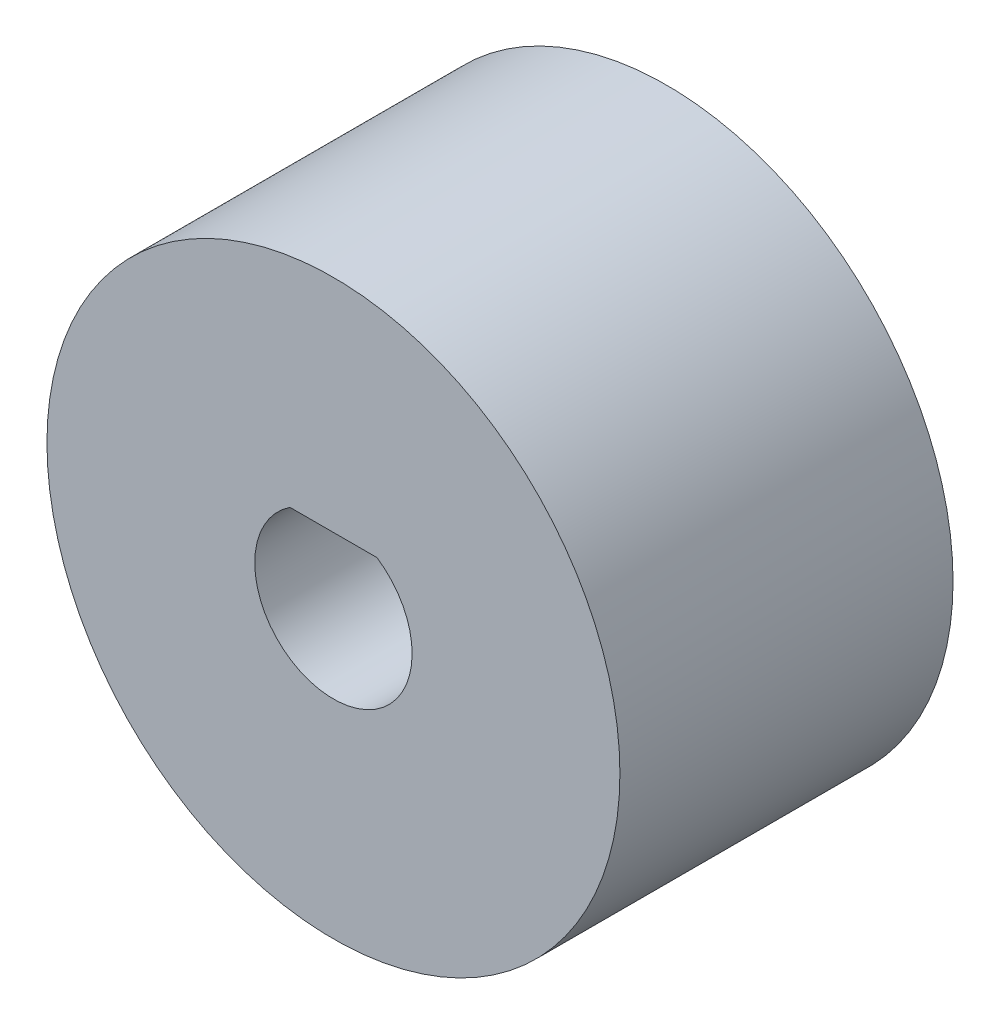
ISO-10303-21;
HEADER;
FILE_DESCRIPTION(('STEP AP214'),'2;1');
FILE_NAME('part.step','',(''),(''),'','','');
FILE_SCHEMA(('AUTOMOTIVE_DESIGN { 1 0 10303 214 1 1 1 1 }'));
ENDSEC;
DATA;
#1=APPLICATION_CONTEXT('core data for automotive mechanical design processes');
#2=APPLICATION_PROTOCOL_DEFINITION('international standard','automotive_design',2000,#1);
#3=PRODUCT_CONTEXT('',#1,'mechanical');
#4=PRODUCT('Part','Part','',(#3));
#5=PRODUCT_RELATED_PRODUCT_CATEGORY('part','',(#4));
#6=PRODUCT_DEFINITION_FORMATION('','',#4);
#7=PRODUCT_DEFINITION_CONTEXT('part definition',#1,'design');
#8=PRODUCT_DEFINITION('design','',#6,#7);
#9=PRODUCT_DEFINITION_SHAPE('','',#8);
#10=(LENGTH_UNIT() NAMED_UNIT(*) SI_UNIT(.MILLI.,.METRE.));
#11=(NAMED_UNIT(*) PLANE_ANGLE_UNIT() SI_UNIT($,.RADIAN.));
#12=(NAMED_UNIT(*) SI_UNIT($,.STERADIAN.) SOLID_ANGLE_UNIT());
#13=UNCERTAINTY_MEASURE_WITH_UNIT(LENGTH_MEASURE(1.E-05),#10,'distance_accuracy_value','');
#14=(GEOMETRIC_REPRESENTATION_CONTEXT(3) GLOBAL_UNCERTAINTY_ASSIGNED_CONTEXT((#13)) GLOBAL_UNIT_ASSIGNED_CONTEXT((#10,
#11,#12)) REPRESENTATION_CONTEXT('',''));
#15=CARTESIAN_POINT('',(0.,0.,0.));
#16=DIRECTION('',(0.,0.,1.));
#17=DIRECTION('',(1.,0.,0.));
#18=AXIS2_PLACEMENT_3D('',#15,#16,#17);
#19=CARTESIAN_POINT('',(0.,0.,12.7));
#20=DIRECTION('',(0.,0.,1.));
#21=DIRECTION('',(1.,0.,0.));
#22=AXIS2_PLACEMENT_3D('',#19,#20,#21);
#23=PLANE('',#22);
#24=CARTESIAN_POINT('',(0.,0.,12.7));
#25=DIRECTION('',(0.,0.,1.));
#26=DIRECTION('',(1.,0.,0.));
#27=AXIS2_PLACEMENT_3D('',#24,#25,#26);
#28=CIRCLE('',#27,10.922);
#29=CARTESIAN_POINT('',(10.922,0.,12.7));
#30=VERTEX_POINT('',#29);
#31=EDGE_CURVE('E11',#30,#30,#28,.T.);
#32=ORIENTED_EDGE('',*,*,#31,.T.);
#33=EDGE_LOOP('',(#32));
#34=FACE_BOUND('',#33,.T.);
#35=DIRECTION('',(-1.,0.,0.));
#36=VECTOR('',#35,1.);
#37=CARTESIAN_POINT('',(-1.6583123951777,2.5,12.7));
#38=LINE('',#37,#36);
#39=CARTESIAN_POINT('',(1.6583123951777,2.5,12.7));
#40=VERTEX_POINT('',#39);
#41=CARTESIAN_POINT('',(-1.6583123951777,2.5,12.7));
#42=VERTEX_POINT('',#41);
#43=EDGE_CURVE('E74',#40,#42,#38,.T.);
#44=ORIENTED_EDGE('',*,*,#43,.F.);
#45=CARTESIAN_POINT('',(0.,0.,12.7));
#46=DIRECTION('',(0.,0.,1.));
#47=DIRECTION('',(1.,0.,0.));
#48=AXIS2_PLACEMENT_3D('',#45,#46,#47);
#49=CIRCLE('',#48,3.);
#50=EDGE_CURVE('E65',#42,#40,#49,.T.);
#51=ORIENTED_EDGE('',*,*,#50,.F.);
#52=EDGE_LOOP('',(#44,#51));
#53=FACE_BOUND('',#52,.T.);
#54=ADVANCED_FACE('F33',(#34,#53),#23,.T.);
#55=CARTESIAN_POINT('',(0.,0.,0.));
#56=DIRECTION('',(0.,0.,1.));
#57=DIRECTION('',(1.,0.,0.));
#58=AXIS2_PLACEMENT_3D('',#55,#56,#57);
#59=PLANE('',#58);
#60=CARTESIAN_POINT('',(0.,0.,0.));
#61=DIRECTION('',(0.,0.,1.));
#62=DIRECTION('',(1.,0.,0.));
#63=AXIS2_PLACEMENT_3D('',#60,#61,#62);
#64=CIRCLE('',#63,10.922);
#65=CARTESIAN_POINT('',(10.922,0.,0.));
#66=VERTEX_POINT('',#65);
#67=EDGE_CURVE('E37',#66,#66,#64,.T.);
#68=ORIENTED_EDGE('',*,*,#67,.F.);
#69=EDGE_LOOP('',(#68));
#70=FACE_BOUND('',#69,.T.);
#71=CARTESIAN_POINT('',(0.,0.,0.));
#72=DIRECTION('',(0.,0.,1.));
#73=DIRECTION('',(1.,0.,0.));
#74=AXIS2_PLACEMENT_3D('',#71,#72,#73);
#75=CIRCLE('',#74,3.);
#76=CARTESIAN_POINT('',(-1.6583123951777,2.5,0.));
#77=VERTEX_POINT('',#76);
#78=CARTESIAN_POINT('',(1.6583123951777,2.5,0.));
#79=VERTEX_POINT('',#78);
#80=EDGE_CURVE('E55',#77,#79,#75,.T.);
#81=ORIENTED_EDGE('',*,*,#80,.T.);
#82=DIRECTION('',(-1.,0.,0.));
#83=VECTOR('',#82,1.);
#84=CARTESIAN_POINT('',(-1.6583123951777,2.5,0.));
#85=LINE('',#84,#83);
#86=EDGE_CURVE('E61',#79,#77,#85,.T.);
#87=ORIENTED_EDGE('',*,*,#86,.T.);
#88=EDGE_LOOP('',(#81,#87));
#89=FACE_BOUND('',#88,.T.);
#90=ADVANCED_FACE('F71',(#70,#89),#59,.F.);
#91=CARTESIAN_POINT('',(0.,0.,12.7));
#92=DIRECTION('',(0.,0.,-1.));
#93=DIRECTION('',(-1.,0.,0.));
#94=AXIS2_PLACEMENT_3D('',#91,#92,#93);
#95=CYLINDRICAL_SURFACE('',#94,10.922);
#96=ORIENTED_EDGE('',*,*,#31,.F.);
#97=EDGE_LOOP('',(#96));
#98=FACE_BOUND('',#97,.T.);
#99=ORIENTED_EDGE('',*,*,#67,.T.);
#100=EDGE_LOOP('',(#99));
#101=FACE_BOUND('',#100,.T.);
#102=ADVANCED_FACE('F35',(#98,#101),#95,.T.);
#103=CARTESIAN_POINT('',(0.,0.,12.7));
#104=DIRECTION('',(0.,0.,-1.));
#105=DIRECTION('',(-1.,0.,0.));
#106=AXIS2_PLACEMENT_3D('',#103,#104,#105);
#107=CYLINDRICAL_SURFACE('',#106,3.);
#108=ORIENTED_EDGE('',*,*,#80,.F.);
#109=DIRECTION('',(0.,0.,-1.));
#110=VECTOR('',#109,1.);
#111=CARTESIAN_POINT('',(-1.6583123951777,2.5,12.7));
#112=LINE('',#111,#110);
#113=EDGE_CURVE('E63',#42,#77,#112,.T.);
#114=ORIENTED_EDGE('',*,*,#113,.F.);
#115=ORIENTED_EDGE('',*,*,#50,.T.);
#116=DIRECTION('',(0.,0.,-1.));
#117=VECTOR('',#116,1.);
#118=CARTESIAN_POINT('',(1.6583123951777,2.5,12.7));
#119=LINE('',#118,#117);
#120=EDGE_CURVE('E48',#40,#79,#119,.T.);
#121=ORIENTED_EDGE('',*,*,#120,.T.);
#122=EDGE_LOOP('',(#108,#114,#115,#121));
#123=FACE_BOUND('',#122,.T.);
#124=ADVANCED_FACE('F67',(#123),#107,.F.);
#125=CARTESIAN_POINT('',(-1.6583123951777,2.5,12.7));
#126=DIRECTION('',(0.,-1.,0.));
#127=DIRECTION('',(0.,0.,-1.));
#128=AXIS2_PLACEMENT_3D('',#125,#126,#127);
#129=PLANE('',#128);
#130=ORIENTED_EDGE('',*,*,#86,.F.);
#131=ORIENTED_EDGE('',*,*,#120,.F.);
#132=ORIENTED_EDGE('',*,*,#43,.T.);
#133=ORIENTED_EDGE('',*,*,#113,.T.);
#134=EDGE_LOOP('',(#130,#131,#132,#133));
#135=FACE_BOUND('',#134,.T.);
#136=ADVANCED_FACE('F62',(#135),#129,.T.);
#137=CLOSED_SHELL('',(#54,#90,#102,#124,#136));
#138=MANIFOLD_SOLID_BREP('B2',#137);
#139=ADVANCED_BREP_SHAPE_REPRESENTATION('',(#18,#138),#14);
#140=SHAPE_DEFINITION_REPRESENTATION(#9,#139);
ENDSEC;
END-ISO-10303-21;
